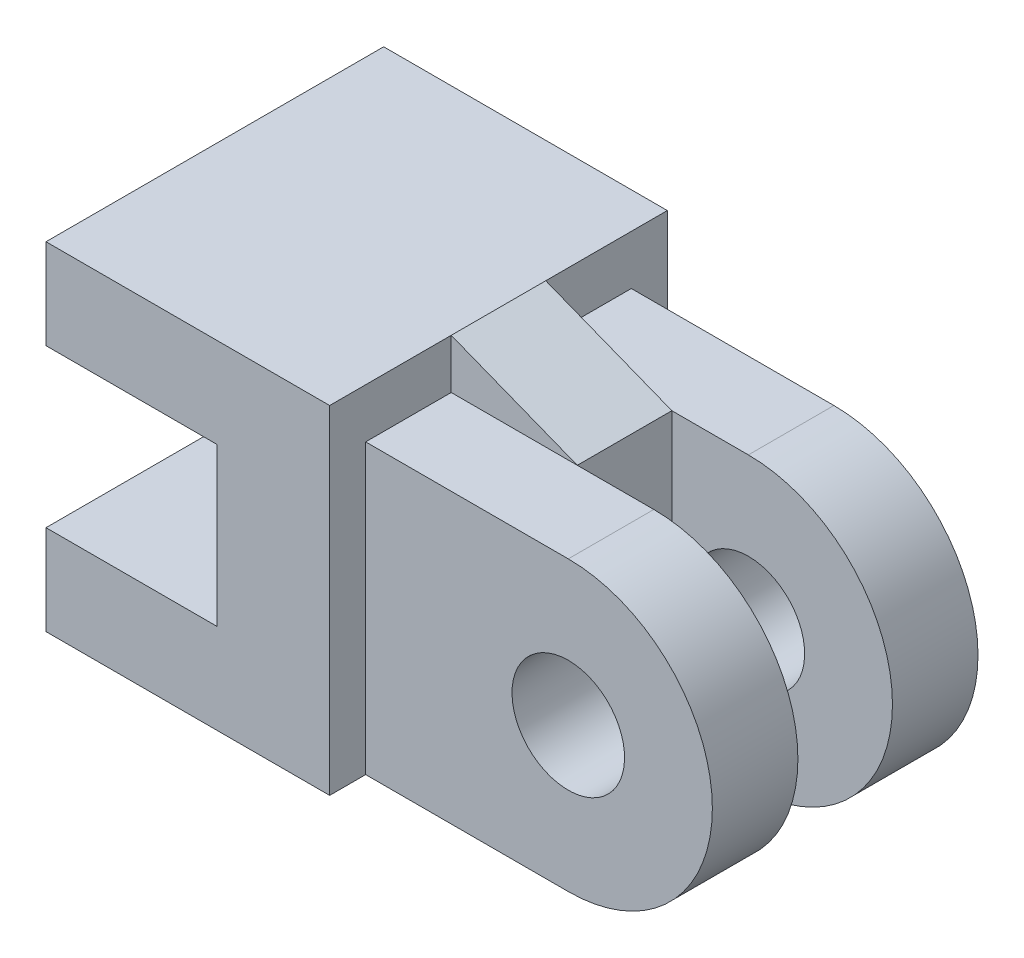
ISO-10303-21;
HEADER;
FILE_DESCRIPTION(('STEP AP214'),'2;1');
FILE_NAME('part.step','',(''),(''),'','','');
FILE_SCHEMA(('AUTOMOTIVE_DESIGN { 1 0 10303 214 1 1 1 1 }'));
ENDSEC;
DATA;
#1=APPLICATION_CONTEXT('core data for automotive mechanical design processes');
#2=APPLICATION_PROTOCOL_DEFINITION('international standard','automotive_design',2000,#1);
#3=PRODUCT_CONTEXT('',#1,'mechanical');
#4=PRODUCT('Part','Part','',(#3));
#5=PRODUCT_RELATED_PRODUCT_CATEGORY('part','',(#4));
#6=PRODUCT_DEFINITION_FORMATION('','',#4);
#7=PRODUCT_DEFINITION_CONTEXT('part definition',#1,'design');
#8=PRODUCT_DEFINITION('design','',#6,#7);
#9=PRODUCT_DEFINITION_SHAPE('','',#8);
#10=(LENGTH_UNIT() NAMED_UNIT(*) SI_UNIT(.MILLI.,.METRE.));
#11=(NAMED_UNIT(*) PLANE_ANGLE_UNIT() SI_UNIT($,.RADIAN.));
#12=(NAMED_UNIT(*) SI_UNIT($,.STERADIAN.) SOLID_ANGLE_UNIT());
#13=UNCERTAINTY_MEASURE_WITH_UNIT(LENGTH_MEASURE(1.E-05),#10,'distance_accuracy_value','');
#14=(GEOMETRIC_REPRESENTATION_CONTEXT(3) GLOBAL_UNCERTAINTY_ASSIGNED_CONTEXT((#13)) GLOBAL_UNIT_ASSIGNED_CONTEXT((#10,
#11,#12)) REPRESENTATION_CONTEXT('',''));
#15=CARTESIAN_POINT('',(0.,0.,0.));
#16=DIRECTION('',(0.,0.,1.));
#17=DIRECTION('',(1.,0.,0.));
#18=AXIS2_PLACEMENT_3D('',#15,#16,#17);
#19=CARTESIAN_POINT('',(-24.5761851015801,44.8318284424379,75.));
#20=DIRECTION('',(-1.,0.,0.));
#21=DIRECTION('',(0.,-1.,0.));
#22=AXIS2_PLACEMENT_3D('',#19,#20,#21);
#23=PLANE('',#22);
#24=DIRECTION('',(0.,-1.,0.));
#25=VECTOR('',#24,1.);
#26=CARTESIAN_POINT('',(-24.5761851015801,44.8318284424379,48.));
#27=LINE('',#26,#25);
#28=CARTESIAN_POINT('',(-24.5761851015801,44.8318284424379,48.));
#29=VERTEX_POINT('',#28);
#30=CARTESIAN_POINT('',(-24.5761851015801,33.8318284424379,48.));
#31=VERTEX_POINT('',#30);
#32=EDGE_CURVE('E184',#29,#31,#27,.T.);
#33=ORIENTED_EDGE('',*,*,#32,.F.);
#34=DIRECTION('',(0.,0.,-1.));
#35=VECTOR('',#34,1.);
#36=CARTESIAN_POINT('',(-24.5761851015801,44.8318284424379,75.));
#37=LINE('',#36,#35);
#38=CARTESIAN_POINT('',(-24.5761851015801,44.8318284424379,75.));
#39=VERTEX_POINT('',#38);
#40=EDGE_CURVE('E194',#39,#29,#37,.T.);
#41=ORIENTED_EDGE('',*,*,#40,.F.);
#42=DIRECTION('',(0.,1.,0.));
#43=VECTOR('',#42,1.);
#44=CARTESIAN_POINT('',(-24.5761851015801,44.8318284424379,75.));
#45=LINE('',#44,#43);
#46=CARTESIAN_POINT('',(-24.5761851015801,-30.1681715575621,75.));
#47=VERTEX_POINT('',#46);
#48=EDGE_CURVE('E341',#47,#39,#45,.T.);
#49=ORIENTED_EDGE('',*,*,#48,.F.);
#50=DIRECTION('',(0.,0.,-1.));
#51=VECTOR('',#50,1.);
#52=CARTESIAN_POINT('',(-24.5761851015801,-30.1681715575621,75.));
#53=LINE('',#52,#51);
#54=CARTESIAN_POINT('',(-24.5761851015801,-30.1681715575621,67.));
#55=VERTEX_POINT('',#54);
#56=EDGE_CURVE('E224',#47,#55,#53,.T.);
#57=ORIENTED_EDGE('',*,*,#56,.T.);
#58=DIRECTION('',(0.,-1.,0.));
#59=VECTOR('',#58,1.);
#60=CARTESIAN_POINT('',(-24.5761851015801,33.8318284424379,67.));
#61=LINE('',#60,#59);
#62=CARTESIAN_POINT('',(-24.5761851015801,33.8318284424379,67.));
#63=VERTEX_POINT('',#62);
#64=EDGE_CURVE('E301',#63,#55,#61,.T.);
#65=ORIENTED_EDGE('',*,*,#64,.F.);
#66=DIRECTION('',(0.,0.,-1.));
#67=VECTOR('',#66,1.);
#68=CARTESIAN_POINT('',(-24.5761851015801,33.8318284424379,67.));
#69=LINE('',#68,#67);
#70=EDGE_CURVE('E297',#63,#31,#69,.T.);
#71=ORIENTED_EDGE('',*,*,#70,.T.);
#72=EDGE_LOOP('',(#33,#41,#49,#57,#65,#71));
#73=FACE_BOUND('',#72,.T.);
#74=ADVANCED_FACE('F47',(#73),#23,.F.);
#75=DIRECTION('',(0.,1.,0.));
#76=VECTOR('',#75,1.);
#77=CARTESIAN_POINT('',(-24.5761851015801,44.8318284424379,27.));
#78=LINE('',#77,#76);
#79=CARTESIAN_POINT('',(-24.5761851015801,33.8318284424379,27.));
#80=VERTEX_POINT('',#79);
#81=CARTESIAN_POINT('',(-24.5761851015801,44.8318284424379,27.));
#82=VERTEX_POINT('',#81);
#83=EDGE_CURVE('E199',#80,#82,#78,.T.);
#84=ORIENTED_EDGE('',*,*,#83,.F.);
#85=DIRECTION('',(0.,0.,-1.));
#86=VECTOR('',#85,1.);
#87=CARTESIAN_POINT('',(-24.5761851015801,33.8318284424379,27.));
#88=LINE('',#87,#86);
#89=CARTESIAN_POINT('',(-24.5761851015801,33.8318284424379,8.00000000000001));
#90=VERTEX_POINT('',#89);
#91=EDGE_CURVE('E285',#80,#90,#88,.T.);
#92=ORIENTED_EDGE('',*,*,#91,.T.);
#93=DIRECTION('',(0.,-1.,0.));
#94=VECTOR('',#93,1.);
#95=CARTESIAN_POINT('',(-24.5761851015801,33.8318284424379,8.));
#96=LINE('',#95,#94);
#97=CARTESIAN_POINT('',(-24.5761851015801,-30.1681715575621,7.99999999999998));
#98=VERTEX_POINT('',#97);
#99=EDGE_CURVE('E293',#90,#98,#96,.T.);
#100=ORIENTED_EDGE('',*,*,#99,.T.);
#101=CARTESIAN_POINT('',(-24.5761851015801,-30.1681715575621,0.));
#102=VERTEX_POINT('',#101);
#103=EDGE_CURVE('E218',#98,#102,#53,.T.);
#104=ORIENTED_EDGE('',*,*,#103,.T.);
#105=DIRECTION('',(0.,1.,0.));
#106=VECTOR('',#105,1.);
#107=CARTESIAN_POINT('',(-24.5761851015801,44.8318284424379,0.));
#108=LINE('',#107,#106);
#109=CARTESIAN_POINT('',(-24.5761851015801,44.8318284424379,0.));
#110=VERTEX_POINT('',#109);
#111=EDGE_CURVE('E211',#102,#110,#108,.T.);
#112=ORIENTED_EDGE('',*,*,#111,.T.);
#113=EDGE_CURVE('E190',#82,#110,#37,.T.);
#114=ORIENTED_EDGE('',*,*,#113,.F.);
#115=EDGE_LOOP('',(#84,#92,#100,#104,#112,#114));
#116=FACE_BOUND('',#115,.T.);
#117=ADVANCED_FACE('F209',(#116),#23,.F.);
#118=CARTESIAN_POINT('',(20.4238148984198,1.83182844243793,27.));
#119=DIRECTION('',(0.,0.,-1.));
#120=DIRECTION('',(-1.,0.,0.));
#121=AXIS2_PLACEMENT_3D('',#118,#119,#120);
#122=CYLINDRICAL_SURFACE('',#121,32.);
#123=DIRECTION('',(0.,0.,1.));
#124=VECTOR('',#123,1.);
#125=CARTESIAN_POINT('',(20.4238148984198,33.8318284424379,27.));
#126=LINE('',#125,#124);
#127=CARTESIAN_POINT('',(20.4238148984198,33.8318284424379,27.));
#128=VERTEX_POINT('',#127);
#129=CARTESIAN_POINT('',(20.4238148984198,33.8318284424379,8.));
#130=VERTEX_POINT('',#129);
#131=EDGE_CURVE('E262',#128,#130,#126,.F.);
#132=ORIENTED_EDGE('',*,*,#131,.F.);
#133=CARTESIAN_POINT('',(20.4238148984198,1.83182844243793,27.));
#134=DIRECTION('',(0.,0.,-1.));
#135=DIRECTION('',(0.,1.,0.));
#136=AXIS2_PLACEMENT_3D('',#133,#134,#135);
#137=CIRCLE('',#136,32.);
#138=CARTESIAN_POINT('',(20.4238148984199,-30.1681715575621,27.));
#139=VERTEX_POINT('',#138);
#140=EDGE_CURVE('E58',#139,#128,#137,.F.);
#141=ORIENTED_EDGE('',*,*,#140,.F.);
#142=DIRECTION('',(0.,0.,-1.));
#143=VECTOR('',#142,1.);
#144=CARTESIAN_POINT('',(20.4238148984199,-30.1681715575621,75.));
#145=LINE('',#144,#143);
#146=CARTESIAN_POINT('',(20.4238148984199,-30.1681715575621,7.99999999999998));
#147=VERTEX_POINT('',#146);
#148=EDGE_CURVE('E266',#147,#139,#145,.F.);
#149=ORIENTED_EDGE('',*,*,#148,.F.);
#150=CARTESIAN_POINT('',(20.4238148984198,1.83182844243793,7.99999999999999));
#151=DIRECTION('',(0.,0.,-1.));
#152=DIRECTION('',(0.,1.,0.));
#153=AXIS2_PLACEMENT_3D('',#150,#151,#152);
#154=CIRCLE('',#153,32.);
#155=EDGE_CURVE('E11',#130,#147,#154,.T.);
#156=ORIENTED_EDGE('',*,*,#155,.F.);
#157=EDGE_LOOP('',(#132,#141,#149,#156));
#158=FACE_BOUND('',#157,.T.);
#159=ADVANCED_FACE('F50',(#158),#122,.T.);
#160=CARTESIAN_POINT('',(20.4238148984198,1.83182844243793,67.));
#161=DIRECTION('',(0.,0.,-1.));
#162=DIRECTION('',(-1.,0.,0.));
#163=AXIS2_PLACEMENT_3D('',#160,#161,#162);
#164=CYLINDRICAL_SURFACE('',#163,32.);
#165=DIRECTION('',(0.,0.,1.));
#166=VECTOR('',#165,1.);
#167=CARTESIAN_POINT('',(20.4238148984198,33.8318284424379,67.));
#168=LINE('',#167,#166);
#169=CARTESIAN_POINT('',(20.4238148984198,33.8318284424379,67.));
#170=VERTEX_POINT('',#169);
#171=CARTESIAN_POINT('',(20.4238148984198,33.8318284424379,48.));
#172=VERTEX_POINT('',#171);
#173=EDGE_CURVE('E248',#170,#172,#168,.F.);
#174=ORIENTED_EDGE('',*,*,#173,.F.);
#175=CARTESIAN_POINT('',(20.4238148984198,1.83182844243793,67.));
#176=DIRECTION('',(0.,0.,-1.));
#177=DIRECTION('',(0.,1.,0.));
#178=AXIS2_PLACEMENT_3D('',#175,#176,#177);
#179=CIRCLE('',#178,32.);
#180=CARTESIAN_POINT('',(20.4238148984199,-30.1681715575621,67.));
#181=VERTEX_POINT('',#180);
#182=EDGE_CURVE('E256',#181,#170,#179,.F.);
#183=ORIENTED_EDGE('',*,*,#182,.F.);
#184=DIRECTION('',(0.,0.,-1.));
#185=VECTOR('',#184,1.);
#186=CARTESIAN_POINT('',(20.4238148984199,-30.1681715575621,75.));
#187=LINE('',#186,#185);
#188=CARTESIAN_POINT('',(20.4238148984199,-30.1681715575621,48.));
#189=VERTEX_POINT('',#188);
#190=EDGE_CURVE('E252',#189,#181,#187,.F.);
#191=ORIENTED_EDGE('',*,*,#190,.F.);
#192=CARTESIAN_POINT('',(20.4238148984198,1.83182844243793,48.));
#193=DIRECTION('',(0.,0.,-1.));
#194=DIRECTION('',(0.,1.,0.));
#195=AXIS2_PLACEMENT_3D('',#192,#193,#194);
#196=CIRCLE('',#195,32.);
#197=EDGE_CURVE('E259',#172,#189,#196,.T.);
#198=ORIENTED_EDGE('',*,*,#197,.F.);
#199=EDGE_LOOP('',(#174,#183,#191,#198));
#200=FACE_BOUND('',#199,.T.);
#201=ADVANCED_FACE('F460',(#200),#164,.T.);
#202=CARTESIAN_POINT('',(-87.5761851015802,44.8318284424379,75.));
#203=DIRECTION('',(1.,0.,0.));
#204=DIRECTION('',(0.,0.,-1.));
#205=AXIS2_PLACEMENT_3D('',#202,#203,#204);
#206=PLANE('',#205);
#207=DIRECTION('',(0.,-1.,0.));
#208=VECTOR('',#207,1.);
#209=CARTESIAN_POINT('',(-87.5761851015802,44.8318284424379,0.));
#210=LINE('',#209,#208);
#211=CARTESIAN_POINT('',(-87.5761851015802,44.8318284424379,0.));
#212=VERTEX_POINT('',#211);
#213=CARTESIAN_POINT('',(-87.5761851015802,24.8318284424379,0.));
#214=VERTEX_POINT('',#213);
#215=EDGE_CURVE('E320',#212,#214,#210,.T.);
#216=ORIENTED_EDGE('',*,*,#215,.T.);
#217=DIRECTION('',(0.,0.,-1.));
#218=VECTOR('',#217,1.);
#219=CARTESIAN_POINT('',(-87.5761851015802,24.8318284424379,75.));
#220=LINE('',#219,#218);
#221=CARTESIAN_POINT('',(-87.5761851015802,24.8318284424379,75.));
#222=VERTEX_POINT('',#221);
#223=EDGE_CURVE('E244',#222,#214,#220,.T.);
#224=ORIENTED_EDGE('',*,*,#223,.F.);
#225=DIRECTION('',(0.,-1.,0.));
#226=VECTOR('',#225,1.);
#227=CARTESIAN_POINT('',(-87.5761851015802,44.8318284424379,75.));
#228=LINE('',#227,#226);
#229=CARTESIAN_POINT('',(-87.5761851015802,44.8318284424379,75.));
#230=VERTEX_POINT('',#229);
#231=EDGE_CURVE('E321',#230,#222,#228,.T.);
#232=ORIENTED_EDGE('',*,*,#231,.F.);
#233=DIRECTION('',(0.,0.,-1.));
#234=VECTOR('',#233,1.);
#235=CARTESIAN_POINT('',(-87.5761851015802,44.8318284424379,75.));
#236=LINE('',#235,#234);
#237=EDGE_CURVE('E214',#230,#212,#236,.T.);
#238=ORIENTED_EDGE('',*,*,#237,.T.);
#239=EDGE_LOOP('',(#216,#224,#232,#238));
#240=FACE_BOUND('',#239,.T.);
#241=ADVANCED_FACE('F372',(#240),#206,.F.);
#242=CARTESIAN_POINT('',(-87.5761851015802,24.8318284424379,75.));
#243=DIRECTION('',(0.,1.,0.));
#244=DIRECTION('',(0.,0.,1.));
#245=AXIS2_PLACEMENT_3D('',#242,#243,#244);
#246=PLANE('',#245);
#247=DIRECTION('',(1.,0.,0.));
#248=VECTOR('',#247,1.);
#249=CARTESIAN_POINT('',(-87.5761851015802,24.8318284424379,0.));
#250=LINE('',#249,#248);
#251=CARTESIAN_POINT('',(-49.5761851015802,24.8318284424379,0.));
#252=VERTEX_POINT('',#251);
#253=EDGE_CURVE('E349',#214,#252,#250,.T.);
#254=ORIENTED_EDGE('',*,*,#253,.T.);
#255=DIRECTION('',(0.,0.,-1.));
#256=VECTOR('',#255,1.);
#257=CARTESIAN_POINT('',(-49.5761851015802,24.8318284424379,75.));
#258=LINE('',#257,#256);
#259=CARTESIAN_POINT('',(-49.5761851015802,24.8318284424379,75.));
#260=VERTEX_POINT('',#259);
#261=EDGE_CURVE('E240',#260,#252,#258,.T.);
#262=ORIENTED_EDGE('',*,*,#261,.F.);
#263=DIRECTION('',(1.,0.,0.));
#264=VECTOR('',#263,1.);
#265=CARTESIAN_POINT('',(-87.5761851015802,24.8318284424379,75.));
#266=LINE('',#265,#264);
#267=EDGE_CURVE('E325',#222,#260,#266,.T.);
#268=ORIENTED_EDGE('',*,*,#267,.F.);
#269=ORIENTED_EDGE('',*,*,#223,.T.);
#270=EDGE_LOOP('',(#254,#262,#268,#269));
#271=FACE_BOUND('',#270,.T.);
#272=ADVANCED_FACE('F379',(#271),#246,.F.);
#273=CARTESIAN_POINT('',(-49.5761851015802,24.8318284424379,75.));
#274=DIRECTION('',(1.,0.,0.));
#275=DIRECTION('',(0.,1.,0.));
#276=AXIS2_PLACEMENT_3D('',#273,#274,#275);
#277=PLANE('',#276);
#278=DIRECTION('',(0.,-1.,0.));
#279=VECTOR('',#278,1.);
#280=CARTESIAN_POINT('',(-49.5761851015802,24.8318284424379,0.));
#281=LINE('',#280,#279);
#282=CARTESIAN_POINT('',(-49.5761851015801,-10.1681715575621,0.));
#283=VERTEX_POINT('',#282);
#284=EDGE_CURVE('E352',#252,#283,#281,.T.);
#285=ORIENTED_EDGE('',*,*,#284,.T.);
#286=DIRECTION('',(0.,0.,-1.));
#287=VECTOR('',#286,1.);
#288=CARTESIAN_POINT('',(-49.5761851015801,-10.1681715575621,75.));
#289=LINE('',#288,#287);
#290=CARTESIAN_POINT('',(-49.5761851015801,-10.1681715575621,75.));
#291=VERTEX_POINT('',#290);
#292=EDGE_CURVE('E236',#291,#283,#289,.T.);
#293=ORIENTED_EDGE('',*,*,#292,.F.);
#294=DIRECTION('',(0.,-1.,0.));
#295=VECTOR('',#294,1.);
#296=CARTESIAN_POINT('',(-49.5761851015802,24.8318284424379,75.));
#297=LINE('',#296,#295);
#298=EDGE_CURVE('E329',#260,#291,#297,.T.);
#299=ORIENTED_EDGE('',*,*,#298,.F.);
#300=ORIENTED_EDGE('',*,*,#261,.T.);
#301=EDGE_LOOP('',(#285,#293,#299,#300));
#302=FACE_BOUND('',#301,.T.);
#303=ADVANCED_FACE('F452',(#302),#277,.F.);
#304=CARTESIAN_POINT('',(-87.5761851015801,-10.1681715575621,75.));
#305=DIRECTION('',(0.,-1.,0.));
#306=DIRECTION('',(0.,0.,-1.));
#307=AXIS2_PLACEMENT_3D('',#304,#305,#306);
#308=PLANE('',#307);
#309=DIRECTION('',(-1.,0.,0.));
#310=VECTOR('',#309,1.);
#311=CARTESIAN_POINT('',(-87.5761851015801,-10.1681715575621,0.));
#312=LINE('',#311,#310);
#313=CARTESIAN_POINT('',(-87.5761851015801,-10.1681715575621,0.));
#314=VERTEX_POINT('',#313);
#315=EDGE_CURVE('E355',#283,#314,#312,.T.);
#316=ORIENTED_EDGE('',*,*,#315,.T.);
#317=DIRECTION('',(0.,0.,-1.));
#318=VECTOR('',#317,1.);
#319=CARTESIAN_POINT('',(-87.5761851015801,-10.1681715575621,75.));
#320=LINE('',#319,#318);
#321=CARTESIAN_POINT('',(-87.5761851015801,-10.1681715575621,75.));
#322=VERTEX_POINT('',#321);
#323=EDGE_CURVE('E232',#322,#314,#320,.T.);
#324=ORIENTED_EDGE('',*,*,#323,.F.);
#325=DIRECTION('',(-1.,0.,0.));
#326=VECTOR('',#325,1.);
#327=CARTESIAN_POINT('',(-87.5761851015801,-10.1681715575621,75.));
#328=LINE('',#327,#326);
#329=EDGE_CURVE('E332',#291,#322,#328,.T.);
#330=ORIENTED_EDGE('',*,*,#329,.F.);
#331=ORIENTED_EDGE('',*,*,#292,.T.);
#332=EDGE_LOOP('',(#316,#324,#330,#331));
#333=FACE_BOUND('',#332,.T.);
#334=ADVANCED_FACE('F448',(#333),#308,.F.);
#335=CARTESIAN_POINT('',(-87.5761851015801,-10.1681715575621,75.));
#336=DIRECTION('',(1.,0.,0.));
#337=DIRECTION('',(0.,0.,-1.));
#338=AXIS2_PLACEMENT_3D('',#335,#336,#337);
#339=PLANE('',#338);
#340=DIRECTION('',(0.,-1.,0.));
#341=VECTOR('',#340,1.);
#342=CARTESIAN_POINT('',(-87.5761851015801,-10.1681715575621,0.));
#343=LINE('',#342,#341);
#344=CARTESIAN_POINT('',(-87.5761851015801,-30.1681715575621,0.));
#345=VERTEX_POINT('',#344);
#346=EDGE_CURVE('E358',#314,#345,#343,.T.);
#347=ORIENTED_EDGE('',*,*,#346,.T.);
#348=DIRECTION('',(0.,0.,-1.));
#349=VECTOR('',#348,1.);
#350=CARTESIAN_POINT('',(-87.5761851015801,-30.1681715575621,75.));
#351=LINE('',#350,#349);
#352=CARTESIAN_POINT('',(-87.5761851015801,-30.1681715575621,75.));
#353=VERTEX_POINT('',#352);
#354=EDGE_CURVE('E228',#353,#345,#351,.T.);
#355=ORIENTED_EDGE('',*,*,#354,.F.);
#356=DIRECTION('',(0.,-1.,0.));
#357=VECTOR('',#356,1.);
#358=CARTESIAN_POINT('',(-87.5761851015801,-10.1681715575621,75.));
#359=LINE('',#358,#357);
#360=EDGE_CURVE('E335',#322,#353,#359,.T.);
#361=ORIENTED_EDGE('',*,*,#360,.F.);
#362=ORIENTED_EDGE('',*,*,#323,.T.);
#363=EDGE_LOOP('',(#347,#355,#361,#362));
#364=FACE_BOUND('',#363,.T.);
#365=ADVANCED_FACE('F444',(#364),#339,.F.);
#366=CARTESIAN_POINT('',(-87.5761851015801,-30.1681715575621,75.));
#367=DIRECTION('',(0.,1.,0.));
#368=DIRECTION('',(0.,0.,1.));
#369=AXIS2_PLACEMENT_3D('',#366,#367,#368);
#370=PLANE('',#369);
#371=DIRECTION('',(-1.,0.,0.));
#372=VECTOR('',#371,1.);
#373=CARTESIAN_POINT('',(52.4238148984199,-30.1681715575621,7.99999999999998));
#374=LINE('',#373,#372);
#375=EDGE_CURVE('E410',#147,#98,#374,.T.);
#376=ORIENTED_EDGE('',*,*,#375,.F.);
#377=ORIENTED_EDGE('',*,*,#148,.T.);
#378=DIRECTION('',(-1.,0.,0.));
#379=VECTOR('',#378,1.);
#380=CARTESIAN_POINT('',(52.4238148984199,-30.1681715575621,27.));
#381=LINE('',#380,#379);
#382=CARTESIAN_POINT('',(3.42381489841986,-30.1681715575621,27.));
#383=VERTEX_POINT('',#382);
#384=EDGE_CURVE('E277',#139,#383,#381,.T.);
#385=ORIENTED_EDGE('',*,*,#384,.T.);
#386=DIRECTION('',(0.,0.,-1.));
#387=VECTOR('',#386,1.);
#388=CARTESIAN_POINT('',(3.42381489841987,-30.1681715575621,48.));
#389=LINE('',#388,#387);
#390=CARTESIAN_POINT('',(3.42381489841987,-30.1681715575621,48.));
#391=VERTEX_POINT('',#390);
#392=EDGE_CURVE('E65',#391,#383,#389,.T.);
#393=ORIENTED_EDGE('',*,*,#392,.F.);
#394=DIRECTION('',(-1.,0.,0.));
#395=VECTOR('',#394,1.);
#396=CARTESIAN_POINT('',(52.4238148984199,-30.1681715575621,48.));
#397=LINE('',#396,#395);
#398=EDGE_CURVE('E316',#189,#391,#397,.T.);
#399=ORIENTED_EDGE('',*,*,#398,.F.);
#400=ORIENTED_EDGE('',*,*,#190,.T.);
#401=DIRECTION('',(-1.,0.,0.));
#402=VECTOR('',#401,1.);
#403=CARTESIAN_POINT('',(52.4238148984199,-30.1681715575621,67.));
#404=LINE('',#403,#402);
#405=EDGE_CURVE('E305',#181,#55,#404,.T.);
#406=ORIENTED_EDGE('',*,*,#405,.T.);
#407=ORIENTED_EDGE('',*,*,#56,.F.);
#408=DIRECTION('',(1.,0.,0.));
#409=VECTOR('',#408,1.);
#410=CARTESIAN_POINT('',(-87.5761851015801,-30.1681715575621,75.));
#411=LINE('',#410,#409);
#412=EDGE_CURVE('E338',#353,#47,#411,.T.);
#413=ORIENTED_EDGE('',*,*,#412,.F.);
#414=ORIENTED_EDGE('',*,*,#354,.T.);
#415=DIRECTION('',(1.,0.,0.));
#416=VECTOR('',#415,1.);
#417=CARTESIAN_POINT('',(-87.5761851015801,-30.1681715575621,0.));
#418=LINE('',#417,#416);
#419=EDGE_CURVE('E361',#345,#102,#418,.T.);
#420=ORIENTED_EDGE('',*,*,#419,.T.);
#421=ORIENTED_EDGE('',*,*,#103,.F.);
#422=EDGE_LOOP('',(#376,#377,#385,#393,#399,#400,#406,#407,#413,#414,#420,#421));
#423=FACE_BOUND('',#422,.T.);
#424=ADVANCED_FACE('F442',(#423),#370,.F.);
#425=CARTESIAN_POINT('',(-87.5761851015802,44.8318284424379,75.));
#426=DIRECTION('',(0.,-1.,0.));
#427=DIRECTION('',(1.,0.,0.));
#428=AXIS2_PLACEMENT_3D('',#425,#426,#427);
#429=PLANE('',#428);
#430=ORIENTED_EDGE('',*,*,#40,.T.);
#431=DIRECTION('',(0.,0.,1.));
#432=VECTOR('',#431,1.);
#433=CARTESIAN_POINT('',(-24.5761851015801,44.8318284424379,-0.001000000000001));
#434=LINE('',#433,#432);
#435=EDGE_CURVE('E177',#82,#29,#434,.T.);
#436=ORIENTED_EDGE('',*,*,#435,.F.);
#437=ORIENTED_EDGE('',*,*,#113,.T.);
#438=DIRECTION('',(-1.,0.,0.));
#439=VECTOR('',#438,1.);
#440=CARTESIAN_POINT('',(-87.5761851015802,44.8318284424379,0.));
#441=LINE('',#440,#439);
#442=EDGE_CURVE('E326',#110,#212,#441,.T.);
#443=ORIENTED_EDGE('',*,*,#442,.T.);
#444=ORIENTED_EDGE('',*,*,#237,.F.);
#445=DIRECTION('',(-1.,0.,0.));
#446=VECTOR('',#445,1.);
#447=CARTESIAN_POINT('',(-87.5761851015802,44.8318284424379,75.));
#448=LINE('',#447,#446);
#449=EDGE_CURVE('E220',#39,#230,#448,.T.);
#450=ORIENTED_EDGE('',*,*,#449,.F.);
#451=EDGE_LOOP('',(#430,#436,#437,#443,#444,#450));
#452=FACE_BOUND('',#451,.T.);
#453=ADVANCED_FACE('F188',(#452),#429,.F.);
#454=CARTESIAN_POINT('',(0.,0.,75.));
#455=DIRECTION('',(0.,0.,1.));
#456=DIRECTION('',(1.,0.,0.));
#457=AXIS2_PLACEMENT_3D('',#454,#455,#456);
#458=PLANE('',#457);
#459=ORIENTED_EDGE('',*,*,#231,.T.);
#460=ORIENTED_EDGE('',*,*,#267,.T.);
#461=ORIENTED_EDGE('',*,*,#298,.T.);
#462=ORIENTED_EDGE('',*,*,#329,.T.);
#463=ORIENTED_EDGE('',*,*,#360,.T.);
#464=ORIENTED_EDGE('',*,*,#412,.T.);
#465=ORIENTED_EDGE('',*,*,#48,.T.);
#466=ORIENTED_EDGE('',*,*,#449,.T.);
#467=EDGE_LOOP('',(#459,#460,#461,#462,#463,#464,#465,#466));
#468=FACE_BOUND('',#467,.T.);
#469=ADVANCED_FACE('F382',(#468),#458,.T.);
#470=CARTESIAN_POINT('',(0.,0.,0.));
#471=DIRECTION('',(0.,0.,1.));
#472=DIRECTION('',(1.,0.,0.));
#473=AXIS2_PLACEMENT_3D('',#470,#471,#472);
#474=PLANE('',#473);
#475=ORIENTED_EDGE('',*,*,#215,.F.);
#476=ORIENTED_EDGE('',*,*,#442,.F.);
#477=ORIENTED_EDGE('',*,*,#111,.F.);
#478=ORIENTED_EDGE('',*,*,#419,.F.);
#479=ORIENTED_EDGE('',*,*,#346,.F.);
#480=ORIENTED_EDGE('',*,*,#315,.F.);
#481=ORIENTED_EDGE('',*,*,#284,.F.);
#482=ORIENTED_EDGE('',*,*,#253,.F.);
#483=EDGE_LOOP('',(#475,#476,#477,#478,#479,#480,#481,#482));
#484=FACE_BOUND('',#483,.T.);
#485=ADVANCED_FACE('F374',(#484),#474,.F.);
#486=CARTESIAN_POINT('',(52.4238148984198,33.8318284424379,48.));
#487=DIRECTION('',(0.,0.,-1.));
#488=DIRECTION('',(0.,1.,0.));
#489=AXIS2_PLACEMENT_3D('',#486,#487,#488);
#490=PLANE('',#489);
#491=DIRECTION('',(0.,-1.,0.));
#492=VECTOR('',#491,1.);
#493=CARTESIAN_POINT('',(3.42381489841985,44.8318284424379,48.));
#494=LINE('',#493,#492);
#495=CARTESIAN_POINT('',(3.42381489841986,33.8318284424379,48.));
#496=VERTEX_POINT('',#495);
#497=EDGE_CURVE('E207',#496,#391,#494,.T.);
#498=ORIENTED_EDGE('',*,*,#497,.F.);
#499=DIRECTION('',(-1.,0.,0.));
#500=VECTOR('',#499,1.);
#501=CARTESIAN_POINT('',(52.4238148984198,33.8318284424379,48.));
#502=LINE('',#501,#500);
#503=EDGE_CURVE('E312',#172,#496,#502,.T.);
#504=ORIENTED_EDGE('',*,*,#503,.F.);
#505=ORIENTED_EDGE('',*,*,#197,.T.);
#506=ORIENTED_EDGE('',*,*,#398,.T.);
#507=EDGE_LOOP('',(#498,#504,#505,#506));
#508=FACE_BOUND('',#507,.T.);
#509=CARTESIAN_POINT('',(20.4238148984199,1.83182844243794,48.));
#510=DIRECTION('',(0.,0.,-1.));
#511=DIRECTION('',(0.,1.,0.));
#512=AXIS2_PLACEMENT_3D('',#509,#510,#511);
#513=CIRCLE('',#512,12.5);
#514=CARTESIAN_POINT('',(20.4238148984199,14.3318284424379,48.));
#515=VERTEX_POINT('',#514);
#516=EDGE_CURVE('E407',#515,#515,#513,.T.);
#517=ORIENTED_EDGE('',*,*,#516,.F.);
#518=EDGE_LOOP('',(#517));
#519=FACE_BOUND('',#518,.T.);
#520=ADVANCED_FACE('F480',(#508,#519),#490,.T.);
#521=CARTESIAN_POINT('',(52.4238148984198,33.8318284424379,67.));
#522=DIRECTION('',(0.,1.,0.));
#523=DIRECTION('',(-1.,0.,0.));
#524=AXIS2_PLACEMENT_3D('',#521,#522,#523);
#525=PLANE('',#524);
#526=DIRECTION('',(-1.,0.,0.));
#527=VECTOR('',#526,1.);
#528=CARTESIAN_POINT('',(52.4238148984198,33.8318284424379,67.));
#529=LINE('',#528,#527);
#530=EDGE_CURVE('E308',#170,#63,#529,.T.);
#531=ORIENTED_EDGE('',*,*,#530,.F.);
#532=ORIENTED_EDGE('',*,*,#173,.T.);
#533=ORIENTED_EDGE('',*,*,#503,.T.);
#534=EDGE_CURVE('E311',#496,#31,#502,.T.);
#535=ORIENTED_EDGE('',*,*,#534,.T.);
#536=ORIENTED_EDGE('',*,*,#70,.F.);
#537=EDGE_LOOP('',(#531,#532,#533,#535,#536));
#538=FACE_BOUND('',#537,.T.);
#539=ADVANCED_FACE('F428',(#538),#525,.T.);
#540=CARTESIAN_POINT('',(52.4238148984198,33.8318284424379,67.));
#541=DIRECTION('',(0.,0.,-1.));
#542=DIRECTION('',(0.,1.,0.));
#543=AXIS2_PLACEMENT_3D('',#540,#541,#542);
#544=PLANE('',#543);
#545=CARTESIAN_POINT('',(20.4238148984199,1.83182844243794,67.));
#546=DIRECTION('',(0.,0.,-1.));
#547=DIRECTION('',(0.,1.,0.));
#548=AXIS2_PLACEMENT_3D('',#545,#546,#547);
#549=CIRCLE('',#548,12.5);
#550=CARTESIAN_POINT('',(20.4238148984199,14.3318284424379,67.));
#551=VERTEX_POINT('',#550);
#552=EDGE_CURVE('E403',#551,#551,#549,.T.);
#553=ORIENTED_EDGE('',*,*,#552,.T.);
#554=EDGE_LOOP('',(#553));
#555=FACE_BOUND('',#554,.T.);
#556=ORIENTED_EDGE('',*,*,#405,.F.);
#557=ORIENTED_EDGE('',*,*,#182,.T.);
#558=ORIENTED_EDGE('',*,*,#530,.T.);
#559=ORIENTED_EDGE('',*,*,#64,.T.);
#560=EDGE_LOOP('',(#556,#557,#558,#559));
#561=FACE_BOUND('',#560,.T.);
#562=ADVANCED_FACE('F419',(#555,#561),#544,.F.);
#563=CARTESIAN_POINT('',(52.4238148984198,33.8318284424379,8.));
#564=DIRECTION('',(0.,0.,-1.));
#565=DIRECTION('',(0.,1.,0.));
#566=AXIS2_PLACEMENT_3D('',#563,#564,#565);
#567=PLANE('',#566);
#568=CARTESIAN_POINT('',(20.4238148984199,1.83182844243794,7.99999999999999));
#569=DIRECTION('',(0.,0.,-1.));
#570=DIRECTION('',(0.,1.,0.));
#571=AXIS2_PLACEMENT_3D('',#568,#569,#570);
#572=CIRCLE('',#571,12.5);
#573=CARTESIAN_POINT('',(20.4238148984199,14.3318284424379,7.99999999999999));
#574=VERTEX_POINT('',#573);
#575=EDGE_CURVE('E399',#574,#574,#572,.T.);
#576=ORIENTED_EDGE('',*,*,#575,.F.);
#577=EDGE_LOOP('',(#576));
#578=FACE_BOUND('',#577,.T.);
#579=DIRECTION('',(-1.,0.,0.));
#580=VECTOR('',#579,1.);
#581=CARTESIAN_POINT('',(52.4238148984198,33.8318284424379,8.));
#582=LINE('',#581,#580);
#583=EDGE_CURVE('E287',#130,#90,#582,.T.);
#584=ORIENTED_EDGE('',*,*,#583,.F.);
#585=ORIENTED_EDGE('',*,*,#155,.T.);
#586=ORIENTED_EDGE('',*,*,#375,.T.);
#587=ORIENTED_EDGE('',*,*,#99,.F.);
#588=EDGE_LOOP('',(#584,#585,#586,#587));
#589=FACE_BOUND('',#588,.T.);
#590=ADVANCED_FACE('F417',(#578,#589),#567,.T.);
#591=CARTESIAN_POINT('',(52.4238148984198,33.8318284424379,27.));
#592=DIRECTION('',(0.,1.,0.));
#593=DIRECTION('',(-1.,0.,0.));
#594=AXIS2_PLACEMENT_3D('',#591,#592,#593);
#595=PLANE('',#594);
#596=DIRECTION('',(-1.,0.,0.));
#597=VECTOR('',#596,1.);
#598=CARTESIAN_POINT('',(52.4238148984198,33.8318284424379,27.));
#599=LINE('',#598,#597);
#600=CARTESIAN_POINT('',(3.42381489841986,33.8318284424379,27.));
#601=VERTEX_POINT('',#600);
#602=EDGE_CURVE('E275',#128,#601,#599,.T.);
#603=ORIENTED_EDGE('',*,*,#602,.F.);
#604=ORIENTED_EDGE('',*,*,#131,.T.);
#605=ORIENTED_EDGE('',*,*,#583,.T.);
#606=ORIENTED_EDGE('',*,*,#91,.F.);
#607=EDGE_CURVE('E202',#601,#80,#599,.T.);
#608=ORIENTED_EDGE('',*,*,#607,.F.);
#609=EDGE_LOOP('',(#603,#604,#605,#606,#608));
#610=FACE_BOUND('',#609,.T.);
#611=ADVANCED_FACE('F280',(#610),#595,.T.);
#612=CARTESIAN_POINT('',(52.4238148984198,33.8318284424379,27.));
#613=DIRECTION('',(0.,0.,-1.));
#614=DIRECTION('',(0.,1.,0.));
#615=AXIS2_PLACEMENT_3D('',#612,#613,#614);
#616=PLANE('',#615);
#617=CARTESIAN_POINT('',(20.4238148984199,1.83182844243794,27.));
#618=DIRECTION('',(0.,0.,-1.));
#619=DIRECTION('',(0.,1.,0.));
#620=AXIS2_PLACEMENT_3D('',#617,#618,#619);
#621=CIRCLE('',#620,12.5);
#622=CARTESIAN_POINT('',(20.4238148984199,14.3318284424379,27.));
#623=VERTEX_POINT('',#622);
#624=EDGE_CURVE('E52',#623,#623,#621,.T.);
#625=ORIENTED_EDGE('',*,*,#624,.T.);
#626=EDGE_LOOP('',(#625));
#627=FACE_BOUND('',#626,.T.);
#628=ORIENTED_EDGE('',*,*,#602,.T.);
#629=DIRECTION('',(0.,1.,0.));
#630=VECTOR('',#629,1.);
#631=CARTESIAN_POINT('',(3.42381489841985,44.8318284424379,27.));
#632=LINE('',#631,#630);
#633=EDGE_CURVE('E396',#383,#601,#632,.T.);
#634=ORIENTED_EDGE('',*,*,#633,.F.);
#635=ORIENTED_EDGE('',*,*,#384,.F.);
#636=ORIENTED_EDGE('',*,*,#140,.T.);
#637=EDGE_LOOP('',(#628,#634,#635,#636));
#638=FACE_BOUND('',#637,.T.);
#639=ADVANCED_FACE('F273',(#627,#638),#616,.F.);
#640=CARTESIAN_POINT('',(20.4238148984199,1.83182844243794,0.));
#641=DIRECTION('',(0.,0.,1.));
#642=DIRECTION('',(1.,0.,0.));
#643=AXIS2_PLACEMENT_3D('',#640,#641,#642);
#644=CYLINDRICAL_SURFACE('',#643,12.5);
#645=ORIENTED_EDGE('',*,*,#575,.T.);
#646=EDGE_LOOP('',(#645));
#647=FACE_BOUND('',#646,.T.);
#648=ORIENTED_EDGE('',*,*,#624,.F.);
#649=EDGE_LOOP('',(#648));
#650=FACE_BOUND('',#649,.T.);
#651=ADVANCED_FACE('F497',(#647,#650),#644,.F.);
#652=ORIENTED_EDGE('',*,*,#516,.T.);
#653=EDGE_LOOP('',(#652));
#654=FACE_BOUND('',#653,.T.);
#655=ORIENTED_EDGE('',*,*,#552,.F.);
#656=EDGE_LOOP('',(#655));
#657=FACE_BOUND('',#656,.T.);
#658=ADVANCED_FACE('F498',(#654,#657),#644,.F.);
#659=CARTESIAN_POINT('',(3.42381489841985,44.8318284424379,48.));
#660=DIRECTION('',(0.,0.,-1.));
#661=DIRECTION('',(-1.,0.,0.));
#662=AXIS2_PLACEMENT_3D('',#659,#660,#661);
#663=PLANE('',#662);
#664=ORIENTED_EDGE('',*,*,#534,.F.);
#665=DIRECTION('',(0.930751493440347,-0.365652372422993,0.));
#666=VECTOR('',#665,1.);
#667=CARTESIAN_POINT('',(-24.5761851015801,44.8318284424379,48.));
#668=LINE('',#667,#666);
#669=EDGE_CURVE('E196',#29,#496,#668,.T.);
#670=ORIENTED_EDGE('',*,*,#669,.F.);
#671=ORIENTED_EDGE('',*,*,#32,.T.);
#672=EDGE_LOOP('',(#664,#670,#671));
#673=FACE_BOUND('',#672,.T.);
#674=ADVANCED_FACE('F483',(#673),#663,.F.);
#675=CARTESIAN_POINT('',(3.42381489841985,44.8318284424379,27.));
#676=DIRECTION('',(0.,0.,1.));
#677=DIRECTION('',(1.,0.,0.));
#678=AXIS2_PLACEMENT_3D('',#675,#676,#677);
#679=PLANE('',#678);
#680=ORIENTED_EDGE('',*,*,#83,.T.);
#681=DIRECTION('',(-0.930751493440347,0.365652372422993,0.));
#682=VECTOR('',#681,1.);
#683=CARTESIAN_POINT('',(-24.5761851015801,44.8318284424379,27.));
#684=LINE('',#683,#682);
#685=EDGE_CURVE('E174',#601,#82,#684,.T.);
#686=ORIENTED_EDGE('',*,*,#685,.F.);
#687=ORIENTED_EDGE('',*,*,#607,.T.);
#688=EDGE_LOOP('',(#680,#686,#687));
#689=FACE_BOUND('',#688,.T.);
#690=ADVANCED_FACE('F200',(#689),#679,.F.);
#691=CARTESIAN_POINT('',(3.42381489841986,0.,0.));
#692=DIRECTION('',(1.,0.,0.));
#693=DIRECTION('',(0.,1.,0.));
#694=AXIS2_PLACEMENT_3D('',#691,#692,#693);
#695=PLANE('',#694);
#696=DIRECTION('',(0.,0.,1.));
#697=VECTOR('',#696,1.);
#698=CARTESIAN_POINT('',(3.42381489841986,33.8318284424379,-0.001000000000001));
#699=LINE('',#698,#697);
#700=EDGE_CURVE('E180',#601,#496,#699,.T.);
#701=ORIENTED_EDGE('',*,*,#700,.T.);
#702=ORIENTED_EDGE('',*,*,#497,.T.);
#703=ORIENTED_EDGE('',*,*,#392,.T.);
#704=ORIENTED_EDGE('',*,*,#633,.T.);
#705=EDGE_LOOP('',(#701,#702,#703,#704));
#706=FACE_BOUND('',#705,.T.);
#707=ADVANCED_FACE('F511',(#706),#695,.T.);
#708=CARTESIAN_POINT('',(-24.5761851015801,44.8318284424379,-0.001000000000001));
#709=DIRECTION('',(-0.365652372422993,-0.930751493440347,0.));
#710=DIRECTION('',(0.930751493440347,-0.365652372422993,0.));
#711=AXIS2_PLACEMENT_3D('',#708,#709,#710);
#712=PLANE('',#711);
#713=ORIENTED_EDGE('',*,*,#685,.T.);
#714=ORIENTED_EDGE('',*,*,#435,.T.);
#715=ORIENTED_EDGE('',*,*,#669,.T.);
#716=ORIENTED_EDGE('',*,*,#700,.F.);
#717=EDGE_LOOP('',(#713,#714,#715,#716));
#718=FACE_BOUND('',#717,.T.);
#719=ADVANCED_FACE('F176',(#718),#712,.F.);
#720=CLOSED_SHELL('',(#74,#117,#159,#201,#241,#272,#303,#334,#365,#424,#453,#469,#485,#520,#539,
#562,#590,#611,#639,#651,#658,#674,#690,#707,#719));
#721=MANIFOLD_SOLID_BREP('B2',#720);
#722=ADVANCED_BREP_SHAPE_REPRESENTATION('',(#18,#721),#14);
#723=SHAPE_DEFINITION_REPRESENTATION(#9,#722);
ENDSEC;
END-ISO-10303-21;
